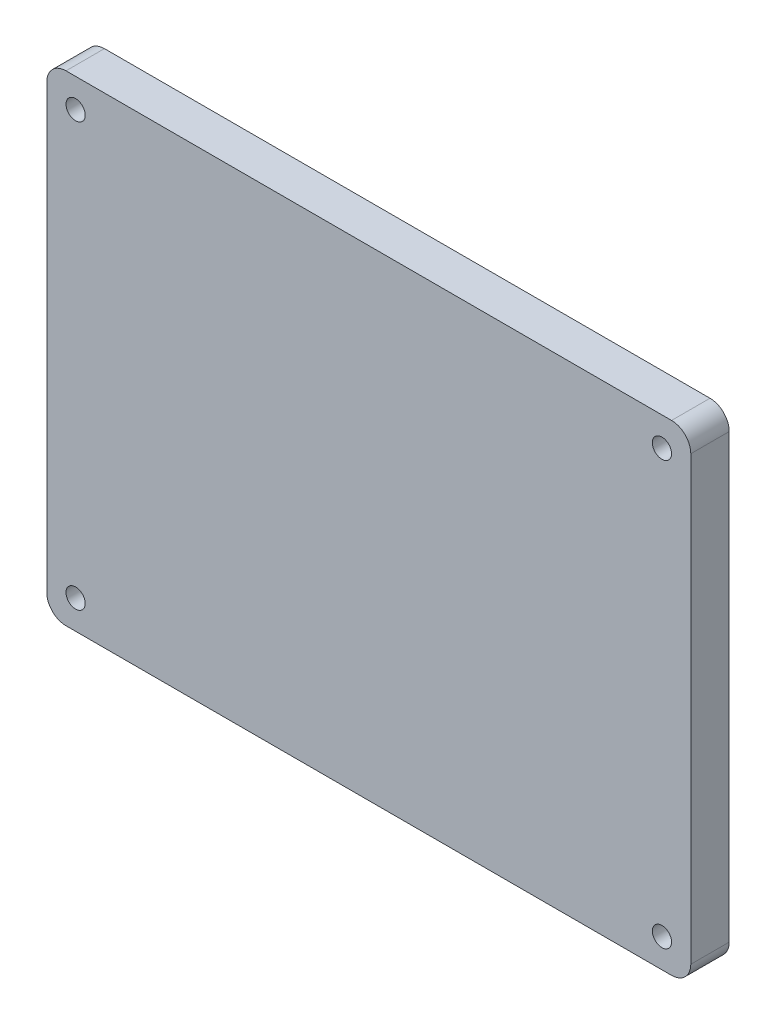
ISO-10303-21;
HEADER;
FILE_DESCRIPTION(('STEP AP214'),'2;1');
FILE_NAME('part.step','',(''),(''),'','','');
FILE_SCHEMA(('AUTOMOTIVE_DESIGN { 1 0 10303 214 1 1 1 1 }'));
ENDSEC;
DATA;
#1=APPLICATION_CONTEXT('core data for automotive mechanical design processes');
#2=APPLICATION_PROTOCOL_DEFINITION('international standard','automotive_design',2000,#1);
#3=PRODUCT_CONTEXT('',#1,'mechanical');
#4=PRODUCT('Part','Part','',(#3));
#5=PRODUCT_RELATED_PRODUCT_CATEGORY('part','',(#4));
#6=PRODUCT_DEFINITION_FORMATION('','',#4);
#7=PRODUCT_DEFINITION_CONTEXT('part definition',#1,'design');
#8=PRODUCT_DEFINITION('design','',#6,#7);
#9=PRODUCT_DEFINITION_SHAPE('','',#8);
#10=(LENGTH_UNIT() NAMED_UNIT(*) SI_UNIT(.MILLI.,.METRE.));
#11=(NAMED_UNIT(*) PLANE_ANGLE_UNIT() SI_UNIT($,.RADIAN.));
#12=(NAMED_UNIT(*) SI_UNIT($,.STERADIAN.) SOLID_ANGLE_UNIT());
#13=UNCERTAINTY_MEASURE_WITH_UNIT(LENGTH_MEASURE(1.E-05),#10,'distance_accuracy_value','');
#14=(GEOMETRIC_REPRESENTATION_CONTEXT(3) GLOBAL_UNCERTAINTY_ASSIGNED_CONTEXT((#13)) GLOBAL_UNIT_ASSIGNED_CONTEXT((#10,
#11,#12)) REPRESENTATION_CONTEXT('',''));
#15=CARTESIAN_POINT('',(0.,0.,0.));
#16=DIRECTION('',(0.,0.,1.));
#17=DIRECTION('',(1.,0.,0.));
#18=AXIS2_PLACEMENT_3D('',#15,#16,#17);
#19=CARTESIAN_POINT('',(0.,0.,20.));
#20=DIRECTION('',(1.,0.,0.));
#21=DIRECTION('',(0.,0.,-1.));
#22=AXIS2_PLACEMENT_3D('',#19,#20,#21);
#23=PLANE('',#22);
#24=DIRECTION('',(0.,-1.,0.));
#25=VECTOR('',#24,1.);
#26=CARTESIAN_POINT('',(0.,0.,0.));
#27=LINE('',#26,#25);
#28=CARTESIAN_POINT('',(0.,240.,0.));
#29=VERTEX_POINT('',#28);
#30=CARTESIAN_POINT('',(0.,10.,0.));
#31=VERTEX_POINT('',#30);
#32=EDGE_CURVE('E157',#29,#31,#27,.T.);
#33=ORIENTED_EDGE('',*,*,#32,.T.);
#34=DIRECTION('',(0.,0.,-1.));
#35=VECTOR('',#34,1.);
#36=CARTESIAN_POINT('',(0.,10.,20.));
#37=LINE('',#36,#35);
#38=CARTESIAN_POINT('',(0.,10.,20.));
#39=VERTEX_POINT('',#38);
#40=EDGE_CURVE('E11',#31,#39,#37,.F.);
#41=ORIENTED_EDGE('',*,*,#40,.T.);
#42=DIRECTION('',(0.,-1.,0.));
#43=VECTOR('',#42,1.);
#44=CARTESIAN_POINT('',(0.,0.,20.));
#45=LINE('',#44,#43);
#46=CARTESIAN_POINT('',(0.,240.,20.));
#47=VERTEX_POINT('',#46);
#48=EDGE_CURVE('E125',#47,#39,#45,.T.);
#49=ORIENTED_EDGE('',*,*,#48,.F.);
#50=DIRECTION('',(0.,0.,-1.));
#51=VECTOR('',#50,1.);
#52=CARTESIAN_POINT('',(0.,240.,20.));
#53=LINE('',#52,#51);
#54=EDGE_CURVE('E41',#47,#29,#53,.T.);
#55=ORIENTED_EDGE('',*,*,#54,.T.);
#56=EDGE_LOOP('',(#33,#41,#49,#55));
#57=FACE_BOUND('',#56,.T.);
#58=ADVANCED_FACE('F33',(#57),#23,.F.);
#59=CARTESIAN_POINT('',(0.,0.,20.));
#60=DIRECTION('',(0.,1.,0.));
#61=DIRECTION('',(0.,0.,1.));
#62=AXIS2_PLACEMENT_3D('',#59,#60,#61);
#63=PLANE('',#62);
#64=DIRECTION('',(1.,0.,0.));
#65=VECTOR('',#64,1.);
#66=CARTESIAN_POINT('',(0.,0.,0.));
#67=LINE('',#66,#65);
#68=CARTESIAN_POINT('',(10.,0.,0.));
#69=VERTEX_POINT('',#68);
#70=CARTESIAN_POINT('',(325.,0.,0.));
#71=VERTEX_POINT('',#70);
#72=EDGE_CURVE('E130',#69,#71,#67,.T.);
#73=ORIENTED_EDGE('',*,*,#72,.T.);
#74=DIRECTION('',(0.,0.,-1.));
#75=VECTOR('',#74,1.);
#76=CARTESIAN_POINT('',(325.,0.,20.));
#77=LINE('',#76,#75);
#78=CARTESIAN_POINT('',(325.,0.,20.));
#79=VERTEX_POINT('',#78);
#80=EDGE_CURVE('E48',#71,#79,#77,.F.);
#81=ORIENTED_EDGE('',*,*,#80,.T.);
#82=DIRECTION('',(1.,0.,0.));
#83=VECTOR('',#82,1.);
#84=CARTESIAN_POINT('',(0.,0.,20.));
#85=LINE('',#84,#83);
#86=CARTESIAN_POINT('',(10.,0.,20.));
#87=VERTEX_POINT('',#86);
#88=EDGE_CURVE('E128',#87,#79,#85,.T.);
#89=ORIENTED_EDGE('',*,*,#88,.F.);
#90=DIRECTION('',(0.,0.,-1.));
#91=VECTOR('',#90,1.);
#92=CARTESIAN_POINT('',(10.,0.,20.));
#93=LINE('',#92,#91);
#94=EDGE_CURVE('E149',#87,#69,#93,.T.);
#95=ORIENTED_EDGE('',*,*,#94,.T.);
#96=EDGE_LOOP('',(#73,#81,#89,#95));
#97=FACE_BOUND('',#96,.T.);
#98=ADVANCED_FACE('F217',(#97),#63,.F.);
#99=CARTESIAN_POINT('',(335.,0.,20.));
#100=DIRECTION('',(-1.,0.,0.));
#101=DIRECTION('',(0.,0.,1.));
#102=AXIS2_PLACEMENT_3D('',#99,#100,#101);
#103=PLANE('',#102);
#104=DIRECTION('',(0.,1.,0.));
#105=VECTOR('',#104,1.);
#106=CARTESIAN_POINT('',(335.,0.,0.));
#107=LINE('',#106,#105);
#108=CARTESIAN_POINT('',(335.,10.,0.));
#109=VERTEX_POINT('',#108);
#110=CARTESIAN_POINT('',(335.,240.,0.));
#111=VERTEX_POINT('',#110);
#112=EDGE_CURVE('E126',#109,#111,#107,.T.);
#113=ORIENTED_EDGE('',*,*,#112,.T.);
#114=DIRECTION('',(0.,0.,-1.));
#115=VECTOR('',#114,1.);
#116=CARTESIAN_POINT('',(335.,240.,20.));
#117=LINE('',#116,#115);
#118=CARTESIAN_POINT('',(335.,240.,20.));
#119=VERTEX_POINT('',#118);
#120=EDGE_CURVE('E104',#111,#119,#117,.F.);
#121=ORIENTED_EDGE('',*,*,#120,.T.);
#122=DIRECTION('',(0.,1.,0.));
#123=VECTOR('',#122,1.);
#124=CARTESIAN_POINT('',(335.,0.,20.));
#125=LINE('',#124,#123);
#126=CARTESIAN_POINT('',(335.,10.,20.));
#127=VERTEX_POINT('',#126);
#128=EDGE_CURVE('E169',#127,#119,#125,.T.);
#129=ORIENTED_EDGE('',*,*,#128,.F.);
#130=DIRECTION('',(0.,0.,-1.));
#131=VECTOR('',#130,1.);
#132=CARTESIAN_POINT('',(335.,10.,20.));
#133=LINE('',#132,#131);
#134=EDGE_CURVE('E109',#127,#109,#133,.T.);
#135=ORIENTED_EDGE('',*,*,#134,.T.);
#136=EDGE_LOOP('',(#113,#121,#129,#135));
#137=FACE_BOUND('',#136,.T.);
#138=ADVANCED_FACE('F214',(#137),#103,.F.);
#139=CARTESIAN_POINT('',(0.,250.,20.));
#140=DIRECTION('',(0.,-1.,0.));
#141=DIRECTION('',(0.,0.,-1.));
#142=AXIS2_PLACEMENT_3D('',#139,#140,#141);
#143=PLANE('',#142);
#144=DIRECTION('',(-1.,0.,0.));
#145=VECTOR('',#144,1.);
#146=CARTESIAN_POINT('',(0.,250.,20.));
#147=LINE('',#146,#145);
#148=CARTESIAN_POINT('',(325.,250.,20.));
#149=VERTEX_POINT('',#148);
#150=CARTESIAN_POINT('',(10.,250.,20.));
#151=VERTEX_POINT('',#150);
#152=EDGE_CURVE('E119',#149,#151,#147,.T.);
#153=ORIENTED_EDGE('',*,*,#152,.F.);
#154=DIRECTION('',(0.,0.,-1.));
#155=VECTOR('',#154,1.);
#156=CARTESIAN_POINT('',(325.,250.,20.));
#157=LINE('',#156,#155);
#158=CARTESIAN_POINT('',(325.,250.,0.));
#159=VERTEX_POINT('',#158);
#160=EDGE_CURVE('E103',#149,#159,#157,.T.);
#161=ORIENTED_EDGE('',*,*,#160,.T.);
#162=DIRECTION('',(-1.,0.,0.));
#163=VECTOR('',#162,1.);
#164=CARTESIAN_POINT('',(0.,250.,0.));
#165=LINE('',#164,#163);
#166=CARTESIAN_POINT('',(10.,250.,0.));
#167=VERTEX_POINT('',#166);
#168=EDGE_CURVE('E116',#159,#167,#165,.T.);
#169=ORIENTED_EDGE('',*,*,#168,.T.);
#170=DIRECTION('',(0.,0.,-1.));
#171=VECTOR('',#170,1.);
#172=CARTESIAN_POINT('',(10.,250.,20.));
#173=LINE('',#172,#171);
#174=EDGE_CURVE('E121',#167,#151,#173,.F.);
#175=ORIENTED_EDGE('',*,*,#174,.T.);
#176=EDGE_LOOP('',(#153,#161,#169,#175));
#177=FACE_BOUND('',#176,.T.);
#178=ADVANCED_FACE('F115',(#177),#143,.F.);
#179=CARTESIAN_POINT('',(0.,0.,20.));
#180=DIRECTION('',(0.,0.,-1.));
#181=DIRECTION('',(-1.,0.,0.));
#182=AXIS2_PLACEMENT_3D('',#179,#180,#181);
#183=PLANE('',#182);
#184=CARTESIAN_POINT('',(15.,235.,20.));
#185=DIRECTION('',(0.,0.,-1.));
#186=DIRECTION('',(-1.,0.,0.));
#187=AXIS2_PLACEMENT_3D('',#184,#185,#186);
#188=CIRCLE('',#187,4.99999999999999);
#189=CARTESIAN_POINT('',(9.99999999999996,235.,20.));
#190=VERTEX_POINT('',#189);
#191=EDGE_CURVE('E162',#190,#190,#188,.T.);
#192=ORIENTED_EDGE('',*,*,#191,.T.);
#193=EDGE_LOOP('',(#192));
#194=FACE_BOUND('',#193,.T.);
#195=CARTESIAN_POINT('',(320.,235.,20.));
#196=DIRECTION('',(0.,0.,-1.));
#197=DIRECTION('',(-1.,0.,0.));
#198=AXIS2_PLACEMENT_3D('',#195,#196,#197);
#199=CIRCLE('',#198,4.99999999999998);
#200=CARTESIAN_POINT('',(315.,235.,20.));
#201=VERTEX_POINT('',#200);
#202=EDGE_CURVE('E165',#201,#201,#199,.T.);
#203=ORIENTED_EDGE('',*,*,#202,.T.);
#204=EDGE_LOOP('',(#203));
#205=FACE_BOUND('',#204,.T.);
#206=CARTESIAN_POINT('',(320.,15.,20.));
#207=DIRECTION('',(0.,0.,-1.));
#208=DIRECTION('',(-1.,0.,0.));
#209=AXIS2_PLACEMENT_3D('',#206,#207,#208);
#210=CIRCLE('',#209,4.99999999999999);
#211=CARTESIAN_POINT('',(315.,15.,20.));
#212=VERTEX_POINT('',#211);
#213=EDGE_CURVE('E175',#212,#212,#210,.T.);
#214=ORIENTED_EDGE('',*,*,#213,.T.);
#215=EDGE_LOOP('',(#214));
#216=FACE_BOUND('',#215,.T.);
#217=CARTESIAN_POINT('',(15.,15.,20.));
#218=DIRECTION('',(0.,0.,-1.));
#219=DIRECTION('',(-1.,0.,0.));
#220=AXIS2_PLACEMENT_3D('',#217,#218,#219);
#221=CIRCLE('',#220,5.);
#222=CARTESIAN_POINT('',(10.,15.,20.));
#223=VERTEX_POINT('',#222);
#224=EDGE_CURVE('E178',#223,#223,#221,.T.);
#225=ORIENTED_EDGE('',*,*,#224,.T.);
#226=EDGE_LOOP('',(#225));
#227=FACE_BOUND('',#226,.T.);
#228=ORIENTED_EDGE('',*,*,#128,.T.);
#229=CARTESIAN_POINT('',(325.,240.,20.));
#230=DIRECTION('',(0.,0.,-1.));
#231=DIRECTION('',(-1.,0.,0.));
#232=AXIS2_PLACEMENT_3D('',#229,#230,#231);
#233=CIRCLE('',#232,10.);
#234=EDGE_CURVE('E147',#119,#149,#233,.F.);
#235=ORIENTED_EDGE('',*,*,#234,.T.);
#236=ORIENTED_EDGE('',*,*,#152,.T.);
#237=CARTESIAN_POINT('',(10.,240.,20.));
#238=DIRECTION('',(0.,0.,-1.));
#239=DIRECTION('',(-1.,0.,0.));
#240=AXIS2_PLACEMENT_3D('',#237,#238,#239);
#241=CIRCLE('',#240,10.);
#242=EDGE_CURVE('E142',#151,#47,#241,.F.);
#243=ORIENTED_EDGE('',*,*,#242,.T.);
#244=ORIENTED_EDGE('',*,*,#48,.T.);
#245=CARTESIAN_POINT('',(10.,10.,20.));
#246=DIRECTION('',(0.,0.,-1.));
#247=DIRECTION('',(-1.,0.,0.));
#248=AXIS2_PLACEMENT_3D('',#245,#246,#247);
#249=CIRCLE('',#248,10.);
#250=EDGE_CURVE('E55',#39,#87,#249,.F.);
#251=ORIENTED_EDGE('',*,*,#250,.T.);
#252=ORIENTED_EDGE('',*,*,#88,.T.);
#253=CARTESIAN_POINT('',(325.,10.,20.));
#254=DIRECTION('',(0.,0.,-1.));
#255=DIRECTION('',(-1.,0.,0.));
#256=AXIS2_PLACEMENT_3D('',#253,#254,#255);
#257=CIRCLE('',#256,10.);
#258=EDGE_CURVE('E145',#79,#127,#257,.F.);
#259=ORIENTED_EDGE('',*,*,#258,.T.);
#260=EDGE_LOOP('',(#228,#235,#236,#243,#244,#251,#252,#259));
#261=FACE_BOUND('',#260,.T.);
#262=ADVANCED_FACE('F204',(#194,#205,#216,#227,#261),#183,.F.);
#263=CARTESIAN_POINT('',(0.,0.,0.));
#264=DIRECTION('',(0.,0.,-1.));
#265=DIRECTION('',(-1.,0.,0.));
#266=AXIS2_PLACEMENT_3D('',#263,#264,#265);
#267=PLANE('',#266);
#268=CARTESIAN_POINT('',(15.,235.,0.));
#269=DIRECTION('',(0.,0.,1.));
#270=DIRECTION('',(-1.,0.,0.));
#271=AXIS2_PLACEMENT_3D('',#268,#269,#270);
#272=CIRCLE('',#271,4.99999999999999);
#273=CARTESIAN_POINT('',(9.99999999999996,235.,0.));
#274=VERTEX_POINT('',#273);
#275=EDGE_CURVE('E185',#274,#274,#272,.T.);
#276=ORIENTED_EDGE('',*,*,#275,.T.);
#277=EDGE_LOOP('',(#276));
#278=FACE_BOUND('',#277,.T.);
#279=CARTESIAN_POINT('',(320.,235.,0.));
#280=DIRECTION('',(0.,0.,1.));
#281=DIRECTION('',(1.,0.,0.));
#282=AXIS2_PLACEMENT_3D('',#279,#280,#281);
#283=CIRCLE('',#282,4.99999999999998);
#284=CARTESIAN_POINT('',(325.,235.,0.));
#285=VERTEX_POINT('',#284);
#286=EDGE_CURVE('E188',#285,#285,#283,.T.);
#287=ORIENTED_EDGE('',*,*,#286,.T.);
#288=EDGE_LOOP('',(#287));
#289=FACE_BOUND('',#288,.T.);
#290=CARTESIAN_POINT('',(320.,15.,0.));
#291=DIRECTION('',(0.,0.,1.));
#292=DIRECTION('',(-1.,0.,0.));
#293=AXIS2_PLACEMENT_3D('',#290,#291,#292);
#294=CIRCLE('',#293,4.99999999999999);
#295=CARTESIAN_POINT('',(315.,15.,0.));
#296=VERTEX_POINT('',#295);
#297=EDGE_CURVE('E184',#296,#296,#294,.T.);
#298=ORIENTED_EDGE('',*,*,#297,.T.);
#299=EDGE_LOOP('',(#298));
#300=FACE_BOUND('',#299,.T.);
#301=CARTESIAN_POINT('',(15.,15.,0.));
#302=DIRECTION('',(0.,0.,1.));
#303=DIRECTION('',(1.,0.,0.));
#304=AXIS2_PLACEMENT_3D('',#301,#302,#303);
#305=CIRCLE('',#304,5.);
#306=CARTESIAN_POINT('',(20.,15.,0.));
#307=VERTEX_POINT('',#306);
#308=EDGE_CURVE('E181',#307,#307,#305,.T.);
#309=ORIENTED_EDGE('',*,*,#308,.T.);
#310=EDGE_LOOP('',(#309));
#311=FACE_BOUND('',#310,.T.);
#312=ORIENTED_EDGE('',*,*,#168,.F.);
#313=CARTESIAN_POINT('',(325.,240.,0.));
#314=DIRECTION('',(0.,0.,-1.));
#315=DIRECTION('',(-1.,0.,0.));
#316=AXIS2_PLACEMENT_3D('',#313,#314,#315);
#317=CIRCLE('',#316,10.);
#318=EDGE_CURVE('E99',#159,#111,#317,.T.);
#319=ORIENTED_EDGE('',*,*,#318,.T.);
#320=ORIENTED_EDGE('',*,*,#112,.F.);
#321=CARTESIAN_POINT('',(325.,10.,0.));
#322=DIRECTION('',(0.,0.,-1.));
#323=DIRECTION('',(-1.,0.,0.));
#324=AXIS2_PLACEMENT_3D('',#321,#322,#323);
#325=CIRCLE('',#324,10.);
#326=EDGE_CURVE('E110',#109,#71,#325,.T.);
#327=ORIENTED_EDGE('',*,*,#326,.T.);
#328=ORIENTED_EDGE('',*,*,#72,.F.);
#329=CARTESIAN_POINT('',(10.,10.,0.));
#330=DIRECTION('',(0.,0.,-1.));
#331=DIRECTION('',(-1.,0.,0.));
#332=AXIS2_PLACEMENT_3D('',#329,#330,#331);
#333=CIRCLE('',#332,10.);
#334=EDGE_CURVE('E136',#69,#31,#333,.T.);
#335=ORIENTED_EDGE('',*,*,#334,.T.);
#336=ORIENTED_EDGE('',*,*,#32,.F.);
#337=CARTESIAN_POINT('',(10.,240.,0.));
#338=DIRECTION('',(0.,0.,-1.));
#339=DIRECTION('',(-1.,0.,0.));
#340=AXIS2_PLACEMENT_3D('',#337,#338,#339);
#341=CIRCLE('',#340,10.);
#342=EDGE_CURVE('E120',#29,#167,#341,.T.);
#343=ORIENTED_EDGE('',*,*,#342,.T.);
#344=EDGE_LOOP('',(#312,#319,#320,#327,#328,#335,#336,#343));
#345=FACE_BOUND('',#344,.T.);
#346=ADVANCED_FACE('F123',(#278,#289,#300,#311,#345),#267,.T.);
#347=CARTESIAN_POINT('',(15.,15.,0.));
#348=DIRECTION('',(0.,0.,1.));
#349=DIRECTION('',(1.,0.,0.));
#350=AXIS2_PLACEMENT_3D('',#347,#348,#349);
#351=CYLINDRICAL_SURFACE('',#350,5.);
#352=ORIENTED_EDGE('',*,*,#308,.F.);
#353=EDGE_LOOP('',(#352));
#354=FACE_BOUND('',#353,.T.);
#355=ORIENTED_EDGE('',*,*,#224,.F.);
#356=EDGE_LOOP('',(#355));
#357=FACE_BOUND('',#356,.T.);
#358=ADVANCED_FACE('F200',(#354,#357),#351,.F.);
#359=CARTESIAN_POINT('',(320.,15.,0.));
#360=DIRECTION('',(0.,0.,1.));
#361=DIRECTION('',(1.,0.,0.));
#362=AXIS2_PLACEMENT_3D('',#359,#360,#361);
#363=CYLINDRICAL_SURFACE('',#362,4.99999999999999);
#364=ORIENTED_EDGE('',*,*,#297,.F.);
#365=EDGE_LOOP('',(#364));
#366=FACE_BOUND('',#365,.T.);
#367=ORIENTED_EDGE('',*,*,#213,.F.);
#368=EDGE_LOOP('',(#367));
#369=FACE_BOUND('',#368,.T.);
#370=ADVANCED_FACE('F196',(#366,#369),#363,.F.);
#371=CARTESIAN_POINT('',(320.,235.,0.));
#372=DIRECTION('',(0.,0.,1.));
#373=DIRECTION('',(1.,0.,0.));
#374=AXIS2_PLACEMENT_3D('',#371,#372,#373);
#375=CYLINDRICAL_SURFACE('',#374,4.99999999999998);
#376=ORIENTED_EDGE('',*,*,#286,.F.);
#377=EDGE_LOOP('',(#376));
#378=FACE_BOUND('',#377,.T.);
#379=ORIENTED_EDGE('',*,*,#202,.F.);
#380=EDGE_LOOP('',(#379));
#381=FACE_BOUND('',#380,.T.);
#382=ADVANCED_FACE('F199',(#378,#381),#375,.F.);
#383=CARTESIAN_POINT('',(15.,235.,0.));
#384=DIRECTION('',(0.,0.,1.));
#385=DIRECTION('',(1.,0.,0.));
#386=AXIS2_PLACEMENT_3D('',#383,#384,#385);
#387=CYLINDRICAL_SURFACE('',#386,4.99999999999999);
#388=ORIENTED_EDGE('',*,*,#275,.F.);
#389=EDGE_LOOP('',(#388));
#390=FACE_BOUND('',#389,.T.);
#391=ORIENTED_EDGE('',*,*,#191,.F.);
#392=EDGE_LOOP('',(#391));
#393=FACE_BOUND('',#392,.T.);
#394=ADVANCED_FACE('F236',(#390,#393),#387,.F.);
#395=CARTESIAN_POINT('',(325.,240.,20.));
#396=DIRECTION('',(0.,0.,-1.));
#397=DIRECTION('',(-1.,0.,0.));
#398=AXIS2_PLACEMENT_3D('',#395,#396,#397);
#399=CYLINDRICAL_SURFACE('',#398,10.);
#400=ORIENTED_EDGE('',*,*,#234,.F.);
#401=ORIENTED_EDGE('',*,*,#120,.F.);
#402=ORIENTED_EDGE('',*,*,#318,.F.);
#403=ORIENTED_EDGE('',*,*,#160,.F.);
#404=EDGE_LOOP('',(#400,#401,#402,#403));
#405=FACE_BOUND('',#404,.T.);
#406=ADVANCED_FACE('F102',(#405),#399,.T.);
#407=CARTESIAN_POINT('',(325.,10.,20.));
#408=DIRECTION('',(0.,0.,-1.));
#409=DIRECTION('',(-1.,0.,0.));
#410=AXIS2_PLACEMENT_3D('',#407,#408,#409);
#411=CYLINDRICAL_SURFACE('',#410,10.);
#412=ORIENTED_EDGE('',*,*,#258,.F.);
#413=ORIENTED_EDGE('',*,*,#80,.F.);
#414=ORIENTED_EDGE('',*,*,#326,.F.);
#415=ORIENTED_EDGE('',*,*,#134,.F.);
#416=EDGE_LOOP('',(#412,#413,#414,#415));
#417=FACE_BOUND('',#416,.T.);
#418=ADVANCED_FACE('F216',(#417),#411,.T.);
#419=CARTESIAN_POINT('',(10.,10.,20.));
#420=DIRECTION('',(0.,0.,-1.));
#421=DIRECTION('',(-1.,0.,0.));
#422=AXIS2_PLACEMENT_3D('',#419,#420,#421);
#423=CYLINDRICAL_SURFACE('',#422,10.);
#424=ORIENTED_EDGE('',*,*,#250,.F.);
#425=ORIENTED_EDGE('',*,*,#40,.F.);
#426=ORIENTED_EDGE('',*,*,#334,.F.);
#427=ORIENTED_EDGE('',*,*,#94,.F.);
#428=EDGE_LOOP('',(#424,#425,#426,#427));
#429=FACE_BOUND('',#428,.T.);
#430=ADVANCED_FACE('F220',(#429),#423,.T.);
#431=CARTESIAN_POINT('',(10.,240.,20.));
#432=DIRECTION('',(0.,0.,-1.));
#433=DIRECTION('',(-1.,0.,0.));
#434=AXIS2_PLACEMENT_3D('',#431,#432,#433);
#435=CYLINDRICAL_SURFACE('',#434,10.);
#436=ORIENTED_EDGE('',*,*,#242,.F.);
#437=ORIENTED_EDGE('',*,*,#174,.F.);
#438=ORIENTED_EDGE('',*,*,#342,.F.);
#439=ORIENTED_EDGE('',*,*,#54,.F.);
#440=EDGE_LOOP('',(#436,#437,#438,#439));
#441=FACE_BOUND('',#440,.T.);
#442=ADVANCED_FACE('F35',(#441),#435,.T.);
#443=CLOSED_SHELL('',(#58,#98,#138,#178,#262,#346,#358,#370,#382,#394,#406,#418,#430,#442));
#444=MANIFOLD_SOLID_BREP('B2',#443);
#445=ADVANCED_BREP_SHAPE_REPRESENTATION('',(#18,#444),#14);
#446=SHAPE_DEFINITION_REPRESENTATION(#9,#445);
ENDSEC;
END-ISO-10303-21;
